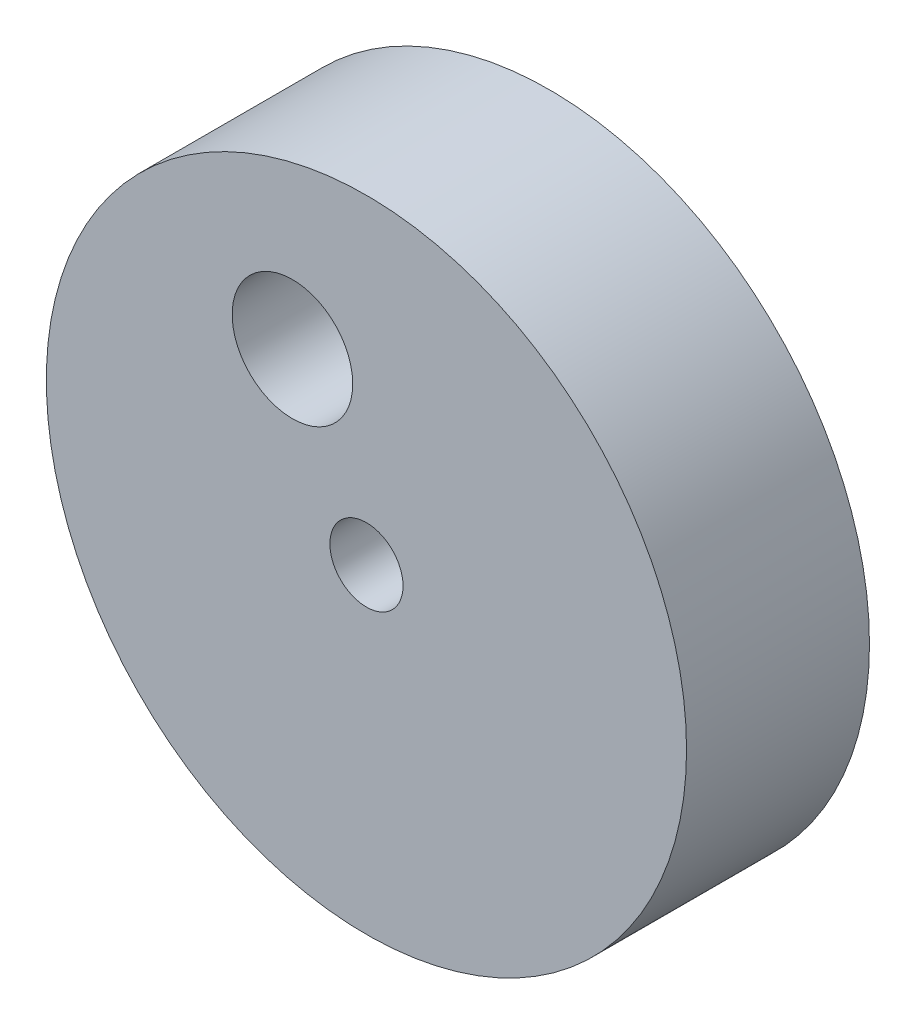
ISO-10303-21;
HEADER;
FILE_DESCRIPTION(('STEP AP214'),'2;1');
FILE_NAME('part.step','',(''),(''),'','','');
FILE_SCHEMA(('AUTOMOTIVE_DESIGN { 1 0 10303 214 1 1 1 1 }'));
ENDSEC;
DATA;
#1=APPLICATION_CONTEXT('core data for automotive mechanical design processes');
#2=APPLICATION_PROTOCOL_DEFINITION('international standard','automotive_design',2000,#1);
#3=PRODUCT_CONTEXT('',#1,'mechanical');
#4=PRODUCT('Part','Part','',(#3));
#5=PRODUCT_RELATED_PRODUCT_CATEGORY('part','',(#4));
#6=PRODUCT_DEFINITION_FORMATION('','',#4);
#7=PRODUCT_DEFINITION_CONTEXT('part definition',#1,'design');
#8=PRODUCT_DEFINITION('design','',#6,#7);
#9=PRODUCT_DEFINITION_SHAPE('','',#8);
#10=(LENGTH_UNIT() NAMED_UNIT(*) SI_UNIT(.MILLI.,.METRE.));
#11=(NAMED_UNIT(*) PLANE_ANGLE_UNIT() SI_UNIT($,.RADIAN.));
#12=(NAMED_UNIT(*) SI_UNIT($,.STERADIAN.) SOLID_ANGLE_UNIT());
#13=UNCERTAINTY_MEASURE_WITH_UNIT(LENGTH_MEASURE(1.E-05),#10,'distance_accuracy_value','');
#14=(GEOMETRIC_REPRESENTATION_CONTEXT(3) GLOBAL_UNCERTAINTY_ASSIGNED_CONTEXT((#13)) GLOBAL_UNIT_ASSIGNED_CONTEXT((#10,
#11,#12)) REPRESENTATION_CONTEXT('',''));
#15=CARTESIAN_POINT('',(0.,0.,0.));
#16=DIRECTION('',(0.,0.,1.));
#17=DIRECTION('',(1.,0.,0.));
#18=AXIS2_PLACEMENT_3D('',#15,#16,#17);
#19=CARTESIAN_POINT('',(0.,0.,100.));
#20=DIRECTION('',(0.,0.,1.));
#21=DIRECTION('',(1.,0.,0.));
#22=AXIS2_PLACEMENT_3D('',#19,#20,#21);
#23=PLANE('',#22);
#24=CARTESIAN_POINT('',(0.,0.,100.));
#25=DIRECTION('',(0.,0.,1.));
#26=DIRECTION('',(1.,0.,0.));
#27=AXIS2_PLACEMENT_3D('',#24,#25,#26);
#28=CIRCLE('',#27,20.);
#29=CARTESIAN_POINT('',(20.,0.,100.));
#30=VERTEX_POINT('',#29);
#31=EDGE_CURVE('E46',#30,#30,#28,.T.);
#32=ORIENTED_EDGE('',*,*,#31,.F.);
#33=EDGE_LOOP('',(#32));
#34=FACE_BOUND('',#33,.T.);
#35=CARTESIAN_POINT('',(0.,0.,100.));
#36=DIRECTION('',(0.,0.,1.));
#37=DIRECTION('',(1.,0.,0.));
#38=AXIS2_PLACEMENT_3D('',#35,#36,#37);
#39=CIRCLE('',#38,175.);
#40=CARTESIAN_POINT('',(175.,0.,100.));
#41=VERTEX_POINT('',#40);
#42=EDGE_CURVE('E10',#41,#41,#39,.T.);
#43=ORIENTED_EDGE('',*,*,#42,.T.);
#44=EDGE_LOOP('',(#43));
#45=FACE_BOUND('',#44,.T.);
#46=CARTESIAN_POINT('',(-40.4643443874537,81.9156240038697,100.));
#47=DIRECTION('',(0.,0.,1.));
#48=DIRECTION('',(1.,0.,0.));
#49=AXIS2_PLACEMENT_3D('',#46,#47,#48);
#50=CIRCLE('',#49,32.9570038803597);
#51=CARTESIAN_POINT('',(-7.50734050709402,81.9156240038697,100.));
#52=VERTEX_POINT('',#51);
#53=EDGE_CURVE('E51',#52,#52,#50,.T.);
#54=ORIENTED_EDGE('',*,*,#53,.F.);
#55=EDGE_LOOP('',(#54));
#56=FACE_BOUND('',#55,.T.);
#57=ADVANCED_FACE('F35',(#34,#45,#56),#23,.T.);
#58=CARTESIAN_POINT('',(0.,0.,0.));
#59=DIRECTION('',(0.,0.,1.));
#60=DIRECTION('',(1.,0.,0.));
#61=AXIS2_PLACEMENT_3D('',#58,#59,#60);
#62=PLANE('',#61);
#63=CARTESIAN_POINT('',(0.,0.,0.));
#64=DIRECTION('',(0.,0.,1.));
#65=DIRECTION('',(1.,0.,0.));
#66=AXIS2_PLACEMENT_3D('',#63,#64,#65);
#67=CIRCLE('',#66,175.);
#68=CARTESIAN_POINT('',(175.,0.,0.));
#69=VERTEX_POINT('',#68);
#70=EDGE_CURVE('E39',#69,#69,#67,.T.);
#71=ORIENTED_EDGE('',*,*,#70,.F.);
#72=EDGE_LOOP('',(#71));
#73=FACE_BOUND('',#72,.T.);
#74=CARTESIAN_POINT('',(0.,0.,0.));
#75=DIRECTION('',(0.,0.,1.));
#76=DIRECTION('',(1.,0.,0.));
#77=AXIS2_PLACEMENT_3D('',#74,#75,#76);
#78=CIRCLE('',#77,20.);
#79=CARTESIAN_POINT('',(20.,0.,0.));
#80=VERTEX_POINT('',#79);
#81=EDGE_CURVE('E48',#80,#80,#78,.T.);
#82=ORIENTED_EDGE('',*,*,#81,.T.);
#83=EDGE_LOOP('',(#82));
#84=FACE_BOUND('',#83,.T.);
#85=CARTESIAN_POINT('',(-40.4643443874537,81.9156240038697,0.));
#86=DIRECTION('',(0.,0.,1.));
#87=DIRECTION('',(1.,0.,0.));
#88=AXIS2_PLACEMENT_3D('',#85,#86,#87);
#89=CIRCLE('',#88,32.9570038803597);
#90=CARTESIAN_POINT('',(-7.50734050709402,81.9156240038697,0.));
#91=VERTEX_POINT('',#90);
#92=EDGE_CURVE('E54',#91,#91,#89,.T.);
#93=ORIENTED_EDGE('',*,*,#92,.T.);
#94=EDGE_LOOP('',(#93));
#95=FACE_BOUND('',#94,.T.);
#96=ADVANCED_FACE('F64',(#73,#84,#95),#62,.F.);
#97=CARTESIAN_POINT('',(0.,0.,100.));
#98=DIRECTION('',(0.,0.,-1.));
#99=DIRECTION('',(-1.,0.,0.));
#100=AXIS2_PLACEMENT_3D('',#97,#98,#99);
#101=CYLINDRICAL_SURFACE('',#100,175.);
#102=ORIENTED_EDGE('',*,*,#42,.F.);
#103=EDGE_LOOP('',(#102));
#104=FACE_BOUND('',#103,.T.);
#105=ORIENTED_EDGE('',*,*,#70,.T.);
#106=EDGE_LOOP('',(#105));
#107=FACE_BOUND('',#106,.T.);
#108=ADVANCED_FACE('F37',(#104,#107),#101,.T.);
#109=CARTESIAN_POINT('',(0.,0.,100.));
#110=DIRECTION('',(0.,0.,-1.));
#111=DIRECTION('',(-1.,0.,0.));
#112=AXIS2_PLACEMENT_3D('',#109,#110,#111);
#113=CYLINDRICAL_SURFACE('',#112,20.);
#114=ORIENTED_EDGE('',*,*,#31,.T.);
#115=EDGE_LOOP('',(#114));
#116=FACE_BOUND('',#115,.T.);
#117=ORIENTED_EDGE('',*,*,#81,.F.);
#118=EDGE_LOOP('',(#117));
#119=FACE_BOUND('',#118,.T.);
#120=ADVANCED_FACE('F73',(#116,#119),#113,.F.);
#121=CARTESIAN_POINT('',(-40.4643443874537,81.9156240038697,100.));
#122=DIRECTION('',(0.,0.,-1.));
#123=DIRECTION('',(-1.,0.,0.));
#124=AXIS2_PLACEMENT_3D('',#121,#122,#123);
#125=CYLINDRICAL_SURFACE('',#124,32.9570038803597);
#126=ORIENTED_EDGE('',*,*,#53,.T.);
#127=EDGE_LOOP('',(#126));
#128=FACE_BOUND('',#127,.T.);
#129=ORIENTED_EDGE('',*,*,#92,.F.);
#130=EDGE_LOOP('',(#129));
#131=FACE_BOUND('',#130,.T.);
#132=ADVANCED_FACE('F60',(#128,#131),#125,.F.);
#133=CLOSED_SHELL('',(#57,#96,#108,#120,#132));
#134=MANIFOLD_SOLID_BREP('B2',#133);
#135=ADVANCED_BREP_SHAPE_REPRESENTATION('',(#18,#134),#14);
#136=SHAPE_DEFINITION_REPRESENTATION(#9,#135);
ENDSEC;
END-ISO-10303-21;
